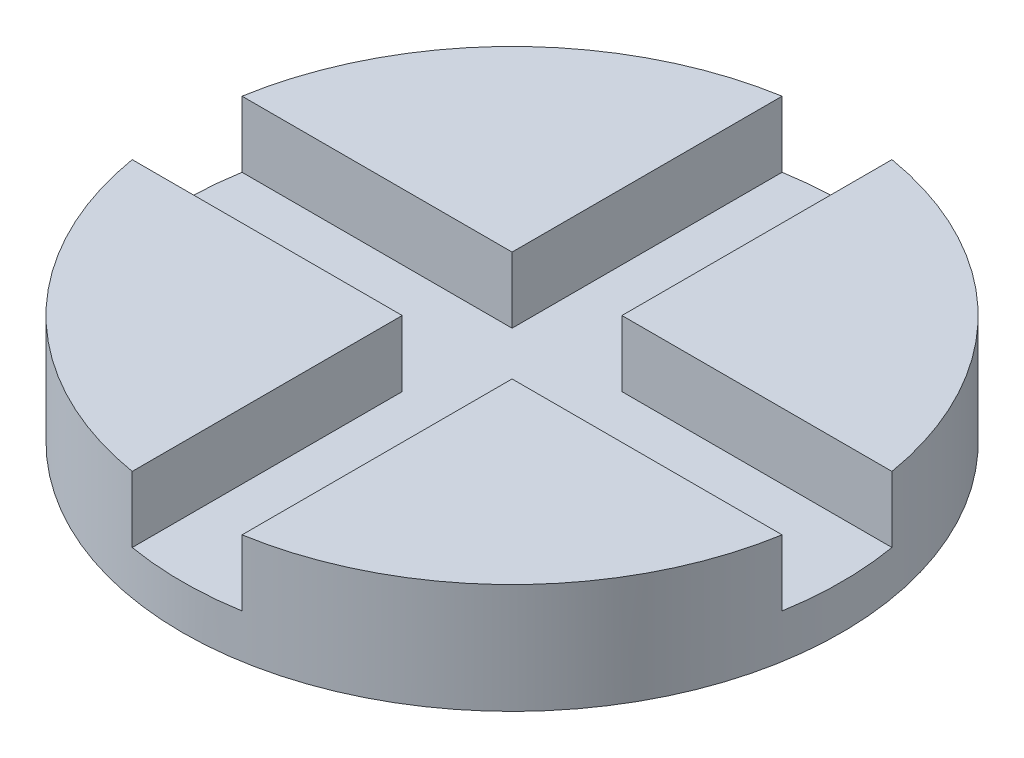
ISO-10303-21;
HEADER;
FILE_DESCRIPTION(('STEP AP214'),'2;1');
FILE_NAME('part.step','',(''),(''),'','','');
FILE_SCHEMA(('AUTOMOTIVE_DESIGN { 1 0 10303 214 1 1 1 1 }'));
ENDSEC;
DATA;
#1=APPLICATION_CONTEXT('core data for automotive mechanical design processes');
#2=APPLICATION_PROTOCOL_DEFINITION('international standard','automotive_design',2000,#1);
#3=PRODUCT_CONTEXT('',#1,'mechanical');
#4=PRODUCT('Part','Part','',(#3));
#5=PRODUCT_RELATED_PRODUCT_CATEGORY('part','',(#4));
#6=PRODUCT_DEFINITION_FORMATION('','',#4);
#7=PRODUCT_DEFINITION_CONTEXT('part definition',#1,'design');
#8=PRODUCT_DEFINITION('design','',#6,#7);
#9=PRODUCT_DEFINITION_SHAPE('','',#8);
#10=(LENGTH_UNIT() NAMED_UNIT(*) SI_UNIT(.MILLI.,.METRE.));
#11=(NAMED_UNIT(*) PLANE_ANGLE_UNIT() SI_UNIT($,.RADIAN.));
#12=(NAMED_UNIT(*) SI_UNIT($,.STERADIAN.) SOLID_ANGLE_UNIT());
#13=UNCERTAINTY_MEASURE_WITH_UNIT(LENGTH_MEASURE(1.E-05),#10,'distance_accuracy_value','');
#14=(GEOMETRIC_REPRESENTATION_CONTEXT(3) GLOBAL_UNCERTAINTY_ASSIGNED_CONTEXT((#13)) GLOBAL_UNIT_ASSIGNED_CONTEXT((#10,
#11,#12)) REPRESENTATION_CONTEXT('',''));
#15=CARTESIAN_POINT('',(0.,0.,0.));
#16=DIRECTION('',(0.,0.,1.));
#17=DIRECTION('',(1.,0.,0.));
#18=AXIS2_PLACEMENT_3D('',#15,#16,#17);
#19=CARTESIAN_POINT('',(0.,20.,0.));
#20=DIRECTION('',(0.,-1.,0.));
#21=DIRECTION('',(0.,0.,-1.));
#22=AXIS2_PLACEMENT_3D('',#19,#20,#21);
#23=CYLINDRICAL_SURFACE('',#22,60.);
#24=CARTESIAN_POINT('',(0.,0.,0.));
#25=DIRECTION('',(0.,1.,0.));
#26=DIRECTION('',(0.,0.,1.));
#27=AXIS2_PLACEMENT_3D('',#24,#25,#26);
#28=CIRCLE('',#27,60.);
#29=CARTESIAN_POINT('',(0.,0.,60.));
#30=VERTEX_POINT('',#29);
#31=EDGE_CURVE('E40',#30,#30,#28,.T.);
#32=ORIENTED_EDGE('',*,*,#31,.T.);
#33=EDGE_LOOP('',(#32));
#34=FACE_BOUND('',#33,.T.);
#35=DIRECTION('',(0.,1.,0.));
#36=VECTOR('',#35,1.);
#37=CARTESIAN_POINT('',(59.1607978309962,8.,-10.));
#38=LINE('',#37,#36);
#39=CARTESIAN_POINT('',(59.1607978309962,8.,-10.));
#40=VERTEX_POINT('',#39);
#41=CARTESIAN_POINT('',(59.1607978309962,20.,-10.));
#42=VERTEX_POINT('',#41);
#43=EDGE_CURVE('E136',#40,#42,#38,.T.);
#44=ORIENTED_EDGE('',*,*,#43,.F.);
#45=CARTESIAN_POINT('',(0.,8.,0.));
#46=DIRECTION('',(0.,1.,0.));
#47=DIRECTION('',(0.,0.,1.));
#48=AXIS2_PLACEMENT_3D('',#45,#46,#47);
#49=CIRCLE('',#48,60.);
#50=CARTESIAN_POINT('',(59.1607978309962,8.,10.));
#51=VERTEX_POINT('',#50);
#52=EDGE_CURVE('E141',#51,#40,#49,.T.);
#53=ORIENTED_EDGE('',*,*,#52,.F.);
#54=DIRECTION('',(0.,1.,0.));
#55=VECTOR('',#54,1.);
#56=CARTESIAN_POINT('',(59.1607978309962,8.,10.));
#57=LINE('',#56,#55);
#58=CARTESIAN_POINT('',(59.1607978309962,20.,10.));
#59=VERTEX_POINT('',#58);
#60=EDGE_CURVE('E154',#51,#59,#57,.T.);
#61=ORIENTED_EDGE('',*,*,#60,.T.);
#62=CARTESIAN_POINT('',(0.,20.,0.));
#63=DIRECTION('',(0.,1.,0.));
#64=DIRECTION('',(0.,0.,1.));
#65=AXIS2_PLACEMENT_3D('',#62,#63,#64);
#66=CIRCLE('',#65,60.);
#67=CARTESIAN_POINT('',(10.,20.,59.1607978309962));
#68=VERTEX_POINT('',#67);
#69=EDGE_CURVE('E11',#68,#59,#66,.T.);
#70=ORIENTED_EDGE('',*,*,#69,.F.);
#71=DIRECTION('',(0.,1.,0.));
#72=VECTOR('',#71,1.);
#73=CARTESIAN_POINT('',(10.,8.,59.1607978309962));
#74=LINE('',#73,#72);
#75=CARTESIAN_POINT('',(10.,8.,59.1607978309962));
#76=VERTEX_POINT('',#75);
#77=EDGE_CURVE('E176',#76,#68,#74,.T.);
#78=ORIENTED_EDGE('',*,*,#77,.F.);
#79=CARTESIAN_POINT('',(0.,8.,0.));
#80=DIRECTION('',(0.,1.,0.));
#81=DIRECTION('',(0.,0.,1.));
#82=AXIS2_PLACEMENT_3D('',#79,#80,#81);
#83=CIRCLE('',#82,60.);
#84=CARTESIAN_POINT('',(-10.,8.,59.1607978309962));
#85=VERTEX_POINT('',#84);
#86=EDGE_CURVE('E277',#85,#76,#83,.T.);
#87=ORIENTED_EDGE('',*,*,#86,.F.);
#88=DIRECTION('',(0.,1.,0.));
#89=VECTOR('',#88,1.);
#90=CARTESIAN_POINT('',(-10.,8.,59.1607978309962));
#91=LINE('',#90,#89);
#92=CARTESIAN_POINT('',(-10.,20.,59.1607978309962));
#93=VERTEX_POINT('',#92);
#94=EDGE_CURVE('E173',#85,#93,#91,.T.);
#95=ORIENTED_EDGE('',*,*,#94,.T.);
#96=CARTESIAN_POINT('',(-59.1607978309962,20.,10.));
#97=VERTEX_POINT('',#96);
#98=EDGE_CURVE('E46',#97,#93,#66,.T.);
#99=ORIENTED_EDGE('',*,*,#98,.F.);
#100=DIRECTION('',(0.,1.,0.));
#101=VECTOR('',#100,1.);
#102=CARTESIAN_POINT('',(-59.1607978309962,8.,10.));
#103=LINE('',#102,#101);
#104=CARTESIAN_POINT('',(-59.1607978309962,8.,10.));
#105=VERTEX_POINT('',#104);
#106=EDGE_CURVE('E169',#105,#97,#103,.T.);
#107=ORIENTED_EDGE('',*,*,#106,.F.);
#108=CARTESIAN_POINT('',(0.,8.,0.));
#109=DIRECTION('',(0.,1.,0.));
#110=DIRECTION('',(0.,0.,1.));
#111=AXIS2_PLACEMENT_3D('',#108,#109,#110);
#112=CIRCLE('',#111,60.);
#113=CARTESIAN_POINT('',(-59.1607978309962,8.,-9.99999999999998));
#114=VERTEX_POINT('',#113);
#115=EDGE_CURVE('E224',#114,#105,#112,.T.);
#116=ORIENTED_EDGE('',*,*,#115,.F.);
#117=DIRECTION('',(0.,1.,0.));
#118=VECTOR('',#117,1.);
#119=CARTESIAN_POINT('',(-59.1607978309962,8.,-9.99999999999998));
#120=LINE('',#119,#118);
#121=CARTESIAN_POINT('',(-59.1607978309962,20.,-9.99999999999998));
#122=VERTEX_POINT('',#121);
#123=EDGE_CURVE('E166',#114,#122,#120,.T.);
#124=ORIENTED_EDGE('',*,*,#123,.T.);
#125=CARTESIAN_POINT('',(-10.,20.,-59.1607978309962));
#126=VERTEX_POINT('',#125);
#127=EDGE_CURVE('E182',#126,#122,#66,.T.);
#128=ORIENTED_EDGE('',*,*,#127,.F.);
#129=DIRECTION('',(0.,1.,0.));
#130=VECTOR('',#129,1.);
#131=CARTESIAN_POINT('',(-10.,8.,-59.1607978309962));
#132=LINE('',#131,#130);
#133=CARTESIAN_POINT('',(-10.,8.,-59.1607978309962));
#134=VERTEX_POINT('',#133);
#135=EDGE_CURVE('E162',#134,#126,#132,.T.);
#136=ORIENTED_EDGE('',*,*,#135,.F.);
#137=CARTESIAN_POINT('',(0.,8.,0.));
#138=DIRECTION('',(0.,1.,0.));
#139=DIRECTION('',(0.,0.,1.));
#140=AXIS2_PLACEMENT_3D('',#137,#138,#139);
#141=CIRCLE('',#140,60.);
#142=CARTESIAN_POINT('',(10.,8.,-59.1607978309962));
#143=VERTEX_POINT('',#142);
#144=EDGE_CURVE('E236',#143,#134,#141,.T.);
#145=ORIENTED_EDGE('',*,*,#144,.F.);
#146=DIRECTION('',(0.,1.,0.));
#147=VECTOR('',#146,1.);
#148=CARTESIAN_POINT('',(10.,8.,-59.1607978309962));
#149=LINE('',#148,#147);
#150=CARTESIAN_POINT('',(10.,20.,-59.1607978309962));
#151=VERTEX_POINT('',#150);
#152=EDGE_CURVE('E156',#143,#151,#149,.T.);
#153=ORIENTED_EDGE('',*,*,#152,.T.);
#154=EDGE_CURVE('E45',#42,#151,#66,.T.);
#155=ORIENTED_EDGE('',*,*,#154,.F.);
#156=EDGE_LOOP('',(#44,#53,#61,#70,#78,#87,#95,#99,#107,#116,#124,#128,#136,#145,#153,#155));
#157=FACE_BOUND('',#156,.T.);
#158=ADVANCED_FACE('F37',(#34,#157),#23,.T.);
#159=CARTESIAN_POINT('',(0.,20.,0.));
#160=DIRECTION('',(0.,1.,0.));
#161=DIRECTION('',(0.,0.,1.));
#162=AXIS2_PLACEMENT_3D('',#159,#160,#161);
#163=PLANE('',#162);
#164=ORIENTED_EDGE('',*,*,#127,.T.);
#165=DIRECTION('',(1.,0.,0.));
#166=VECTOR('',#165,1.);
#167=CARTESIAN_POINT('',(0.,20.,-10.));
#168=LINE('',#167,#166);
#169=CARTESIAN_POINT('',(-10.,20.,-10.));
#170=VERTEX_POINT('',#169);
#171=EDGE_CURVE('E210',#122,#170,#168,.T.);
#172=ORIENTED_EDGE('',*,*,#171,.T.);
#173=DIRECTION('',(0.,0.,1.));
#174=VECTOR('',#173,1.);
#175=CARTESIAN_POINT('',(-10.,20.,0.));
#176=LINE('',#175,#174);
#177=EDGE_CURVE('E199',#126,#170,#176,.T.);
#178=ORIENTED_EDGE('',*,*,#177,.F.);
#179=EDGE_LOOP('',(#164,#172,#178));
#180=FACE_BOUND('',#179,.T.);
#181=ADVANCED_FACE('F217',(#180),#163,.T.);
#182=ORIENTED_EDGE('',*,*,#154,.T.);
#183=DIRECTION('',(0.,0.,1.));
#184=VECTOR('',#183,1.);
#185=CARTESIAN_POINT('',(10.,20.,0.));
#186=LINE('',#185,#184);
#187=CARTESIAN_POINT('',(10.,20.,-10.));
#188=VERTEX_POINT('',#187);
#189=EDGE_CURVE('E195',#151,#188,#186,.T.);
#190=ORIENTED_EDGE('',*,*,#189,.T.);
#191=DIRECTION('',(1.,0.,0.));
#192=VECTOR('',#191,1.);
#193=CARTESIAN_POINT('',(0.,20.,-10.));
#194=LINE('',#193,#192);
#195=EDGE_CURVE('E196',#188,#42,#194,.T.);
#196=ORIENTED_EDGE('',*,*,#195,.T.);
#197=EDGE_LOOP('',(#182,#190,#196));
#198=FACE_BOUND('',#197,.T.);
#199=ADVANCED_FACE('F194',(#198),#163,.T.);
#200=DIRECTION('',(1.,0.,0.));
#201=VECTOR('',#200,1.);
#202=CARTESIAN_POINT('',(0.,20.,10.));
#203=LINE('',#202,#201);
#204=CARTESIAN_POINT('',(10.,20.,10.));
#205=VERTEX_POINT('',#204);
#206=EDGE_CURVE('E98',#205,#59,#203,.T.);
#207=ORIENTED_EDGE('',*,*,#206,.F.);
#208=DIRECTION('',(0.,0.,1.));
#209=VECTOR('',#208,1.);
#210=CARTESIAN_POINT('',(10.,20.,0.));
#211=LINE('',#210,#209);
#212=EDGE_CURVE('E53',#205,#68,#211,.T.);
#213=ORIENTED_EDGE('',*,*,#212,.T.);
#214=ORIENTED_EDGE('',*,*,#69,.T.);
#215=EDGE_LOOP('',(#207,#213,#214));
#216=FACE_BOUND('',#215,.T.);
#217=ADVANCED_FACE('F261',(#216),#163,.T.);
#218=DIRECTION('',(0.,0.,1.));
#219=VECTOR('',#218,1.);
#220=CARTESIAN_POINT('',(-10.,20.,0.));
#221=LINE('',#220,#219);
#222=CARTESIAN_POINT('',(-10.,20.,10.));
#223=VERTEX_POINT('',#222);
#224=EDGE_CURVE('E205',#223,#93,#221,.T.);
#225=ORIENTED_EDGE('',*,*,#224,.F.);
#226=DIRECTION('',(1.,0.,0.));
#227=VECTOR('',#226,1.);
#228=CARTESIAN_POINT('',(0.,20.,10.));
#229=LINE('',#228,#227);
#230=EDGE_CURVE('E207',#97,#223,#229,.T.);
#231=ORIENTED_EDGE('',*,*,#230,.F.);
#232=ORIENTED_EDGE('',*,*,#98,.T.);
#233=EDGE_LOOP('',(#225,#231,#232));
#234=FACE_BOUND('',#233,.T.);
#235=ADVANCED_FACE('F257',(#234),#163,.T.);
#236=CARTESIAN_POINT('',(0.,0.,0.));
#237=DIRECTION('',(0.,1.,0.));
#238=DIRECTION('',(0.,0.,1.));
#239=AXIS2_PLACEMENT_3D('',#236,#237,#238);
#240=PLANE('',#239);
#241=ORIENTED_EDGE('',*,*,#31,.F.);
#242=EDGE_LOOP('',(#241));
#243=FACE_BOUND('',#242,.T.);
#244=ADVANCED_FACE('F264',(#243),#240,.F.);
#245=CARTESIAN_POINT('',(10.,8.,0.));
#246=DIRECTION('',(-1.,0.,0.));
#247=DIRECTION('',(0.,0.,1.));
#248=AXIS2_PLACEMENT_3D('',#245,#246,#247);
#249=PLANE('',#248);
#250=ORIENTED_EDGE('',*,*,#212,.F.);
#251=DIRECTION('',(0.,1.,0.));
#252=VECTOR('',#251,1.);
#253=CARTESIAN_POINT('',(10.,8.,10.));
#254=LINE('',#253,#252);
#255=CARTESIAN_POINT('',(10.,8.,10.));
#256=VERTEX_POINT('',#255);
#257=EDGE_CURVE('E58',#256,#205,#254,.T.);
#258=ORIENTED_EDGE('',*,*,#257,.F.);
#259=DIRECTION('',(0.,0.,1.));
#260=VECTOR('',#259,1.);
#261=CARTESIAN_POINT('',(10.,8.,0.));
#262=LINE('',#261,#260);
#263=EDGE_CURVE('E102',#256,#76,#262,.T.);
#264=ORIENTED_EDGE('',*,*,#263,.T.);
#265=ORIENTED_EDGE('',*,*,#77,.T.);
#266=EDGE_LOOP('',(#250,#258,#264,#265));
#267=FACE_BOUND('',#266,.T.);
#268=ADVANCED_FACE('F269',(#267),#249,.T.);
#269=CARTESIAN_POINT('',(-10.,8.,0.));
#270=DIRECTION('',(-1.,0.,0.));
#271=DIRECTION('',(0.,0.,1.));
#272=AXIS2_PLACEMENT_3D('',#269,#270,#271);
#273=PLANE('',#272);
#274=ORIENTED_EDGE('',*,*,#224,.T.);
#275=ORIENTED_EDGE('',*,*,#94,.F.);
#276=DIRECTION('',(0.,0.,1.));
#277=VECTOR('',#276,1.);
#278=CARTESIAN_POINT('',(-10.,8.,0.));
#279=LINE('',#278,#277);
#280=CARTESIAN_POINT('',(-10.,8.,10.));
#281=VERTEX_POINT('',#280);
#282=EDGE_CURVE('E231',#281,#85,#279,.T.);
#283=ORIENTED_EDGE('',*,*,#282,.F.);
#284=DIRECTION('',(0.,1.,0.));
#285=VECTOR('',#284,1.);
#286=CARTESIAN_POINT('',(-10.,8.,10.));
#287=LINE('',#286,#285);
#288=EDGE_CURVE('E171',#281,#223,#287,.T.);
#289=ORIENTED_EDGE('',*,*,#288,.T.);
#290=EDGE_LOOP('',(#274,#275,#283,#289));
#291=FACE_BOUND('',#290,.T.);
#292=ADVANCED_FACE('F273',(#291),#273,.F.);
#293=CARTESIAN_POINT('',(0.,8.,10.));
#294=DIRECTION('',(0.,0.,1.));
#295=DIRECTION('',(1.,0.,0.));
#296=AXIS2_PLACEMENT_3D('',#293,#294,#295);
#297=PLANE('',#296);
#298=ORIENTED_EDGE('',*,*,#230,.T.);
#299=ORIENTED_EDGE('',*,*,#288,.F.);
#300=DIRECTION('',(1.,0.,0.));
#301=VECTOR('',#300,1.);
#302=CARTESIAN_POINT('',(0.,8.,10.));
#303=LINE('',#302,#301);
#304=EDGE_CURVE('E227',#105,#281,#303,.T.);
#305=ORIENTED_EDGE('',*,*,#304,.F.);
#306=ORIENTED_EDGE('',*,*,#106,.T.);
#307=EDGE_LOOP('',(#298,#299,#305,#306));
#308=FACE_BOUND('',#307,.T.);
#309=ADVANCED_FACE('F282',(#308),#297,.F.);
#310=CARTESIAN_POINT('',(0.,8.,-10.));
#311=DIRECTION('',(0.,0.,1.));
#312=DIRECTION('',(1.,0.,0.));
#313=AXIS2_PLACEMENT_3D('',#310,#311,#312);
#314=PLANE('',#313);
#315=ORIENTED_EDGE('',*,*,#171,.F.);
#316=ORIENTED_EDGE('',*,*,#123,.F.);
#317=DIRECTION('',(1.,0.,0.));
#318=VECTOR('',#317,1.);
#319=CARTESIAN_POINT('',(0.,8.,-10.));
#320=LINE('',#319,#318);
#321=CARTESIAN_POINT('',(-10.,8.,-10.));
#322=VERTEX_POINT('',#321);
#323=EDGE_CURVE('E226',#114,#322,#320,.T.);
#324=ORIENTED_EDGE('',*,*,#323,.T.);
#325=DIRECTION('',(0.,1.,0.));
#326=VECTOR('',#325,1.);
#327=CARTESIAN_POINT('',(-10.,8.,-10.));
#328=LINE('',#327,#326);
#329=EDGE_CURVE('E164',#322,#170,#328,.T.);
#330=ORIENTED_EDGE('',*,*,#329,.T.);
#331=EDGE_LOOP('',(#315,#316,#324,#330));
#332=FACE_BOUND('',#331,.T.);
#333=ADVANCED_FACE('F219',(#332),#314,.T.);
#334=CARTESIAN_POINT('',(-10.,8.,0.));
#335=DIRECTION('',(-1.,0.,0.));
#336=DIRECTION('',(0.,0.,1.));
#337=AXIS2_PLACEMENT_3D('',#334,#335,#336);
#338=PLANE('',#337);
#339=ORIENTED_EDGE('',*,*,#177,.T.);
#340=ORIENTED_EDGE('',*,*,#329,.F.);
#341=DIRECTION('',(0.,0.,1.));
#342=VECTOR('',#341,1.);
#343=CARTESIAN_POINT('',(-10.,8.,0.));
#344=LINE('',#343,#342);
#345=EDGE_CURVE('E229',#134,#322,#344,.T.);
#346=ORIENTED_EDGE('',*,*,#345,.F.);
#347=ORIENTED_EDGE('',*,*,#135,.T.);
#348=EDGE_LOOP('',(#339,#340,#346,#347));
#349=FACE_BOUND('',#348,.T.);
#350=ADVANCED_FACE('F214',(#349),#338,.F.);
#351=CARTESIAN_POINT('',(10.,8.,0.));
#352=DIRECTION('',(-1.,0.,0.));
#353=DIRECTION('',(0.,0.,1.));
#354=AXIS2_PLACEMENT_3D('',#351,#352,#353);
#355=PLANE('',#354);
#356=ORIENTED_EDGE('',*,*,#189,.F.);
#357=ORIENTED_EDGE('',*,*,#152,.F.);
#358=DIRECTION('',(0.,0.,1.));
#359=VECTOR('',#358,1.);
#360=CARTESIAN_POINT('',(10.,8.,0.));
#361=LINE('',#360,#359);
#362=CARTESIAN_POINT('',(10.,8.,-10.));
#363=VERTEX_POINT('',#362);
#364=EDGE_CURVE('E142',#143,#363,#361,.T.);
#365=ORIENTED_EDGE('',*,*,#364,.T.);
#366=DIRECTION('',(0.,1.,0.));
#367=VECTOR('',#366,1.);
#368=CARTESIAN_POINT('',(10.,8.,-10.));
#369=LINE('',#368,#367);
#370=EDGE_CURVE('E138',#363,#188,#369,.T.);
#371=ORIENTED_EDGE('',*,*,#370,.T.);
#372=EDGE_LOOP('',(#356,#357,#365,#371));
#373=FACE_BOUND('',#372,.T.);
#374=ADVANCED_FACE('F240',(#373),#355,.T.);
#375=CARTESIAN_POINT('',(0.,8.,-10.));
#376=DIRECTION('',(0.,0.,1.));
#377=DIRECTION('',(1.,0.,0.));
#378=AXIS2_PLACEMENT_3D('',#375,#376,#377);
#379=PLANE('',#378);
#380=ORIENTED_EDGE('',*,*,#195,.F.);
#381=ORIENTED_EDGE('',*,*,#370,.F.);
#382=DIRECTION('',(1.,0.,0.));
#383=VECTOR('',#382,1.);
#384=CARTESIAN_POINT('',(0.,8.,-10.));
#385=LINE('',#384,#383);
#386=EDGE_CURVE('E131',#363,#40,#385,.T.);
#387=ORIENTED_EDGE('',*,*,#386,.T.);
#388=ORIENTED_EDGE('',*,*,#43,.T.);
#389=EDGE_LOOP('',(#380,#381,#387,#388));
#390=FACE_BOUND('',#389,.T.);
#391=ADVANCED_FACE('F134',(#390),#379,.T.);
#392=CARTESIAN_POINT('',(0.,8.,10.));
#393=DIRECTION('',(0.,0.,1.));
#394=DIRECTION('',(1.,0.,0.));
#395=AXIS2_PLACEMENT_3D('',#392,#393,#394);
#396=PLANE('',#395);
#397=ORIENTED_EDGE('',*,*,#206,.T.);
#398=ORIENTED_EDGE('',*,*,#60,.F.);
#399=DIRECTION('',(1.,0.,0.));
#400=VECTOR('',#399,1.);
#401=CARTESIAN_POINT('',(0.,8.,10.));
#402=LINE('',#401,#400);
#403=EDGE_CURVE('E148',#256,#51,#402,.T.);
#404=ORIENTED_EDGE('',*,*,#403,.F.);
#405=ORIENTED_EDGE('',*,*,#257,.T.);
#406=EDGE_LOOP('',(#397,#398,#404,#405));
#407=FACE_BOUND('',#406,.T.);
#408=ADVANCED_FACE('F248',(#407),#396,.F.);
#409=CARTESIAN_POINT('',(0.,8.,0.));
#410=DIRECTION('',(0.,1.,0.));
#411=DIRECTION('',(0.,0.,1.));
#412=AXIS2_PLACEMENT_3D('',#409,#410,#411);
#413=PLANE('',#412);
#414=ORIENTED_EDGE('',*,*,#263,.F.);
#415=ORIENTED_EDGE('',*,*,#403,.T.);
#416=ORIENTED_EDGE('',*,*,#52,.T.);
#417=ORIENTED_EDGE('',*,*,#386,.F.);
#418=ORIENTED_EDGE('',*,*,#364,.F.);
#419=ORIENTED_EDGE('',*,*,#144,.T.);
#420=ORIENTED_EDGE('',*,*,#345,.T.);
#421=ORIENTED_EDGE('',*,*,#323,.F.);
#422=ORIENTED_EDGE('',*,*,#115,.T.);
#423=ORIENTED_EDGE('',*,*,#304,.T.);
#424=ORIENTED_EDGE('',*,*,#282,.T.);
#425=ORIENTED_EDGE('',*,*,#86,.T.);
#426=EDGE_LOOP('',(#414,#415,#416,#417,#418,#419,#420,#421,#422,#423,#424,#425));
#427=FACE_BOUND('',#426,.T.);
#428=ADVANCED_FACE('F146',(#427),#413,.T.);
#429=CLOSED_SHELL('',(#158,#181,#199,#217,#235,#244,#268,#292,#309,#333,#350,#374,#391,#408,#428));
#430=MANIFOLD_SOLID_BREP('B2',#429);
#431=ADVANCED_BREP_SHAPE_REPRESENTATION('',(#18,#430),#14);
#432=SHAPE_DEFINITION_REPRESENTATION(#9,#431);
ENDSEC;
END-ISO-10303-21;
